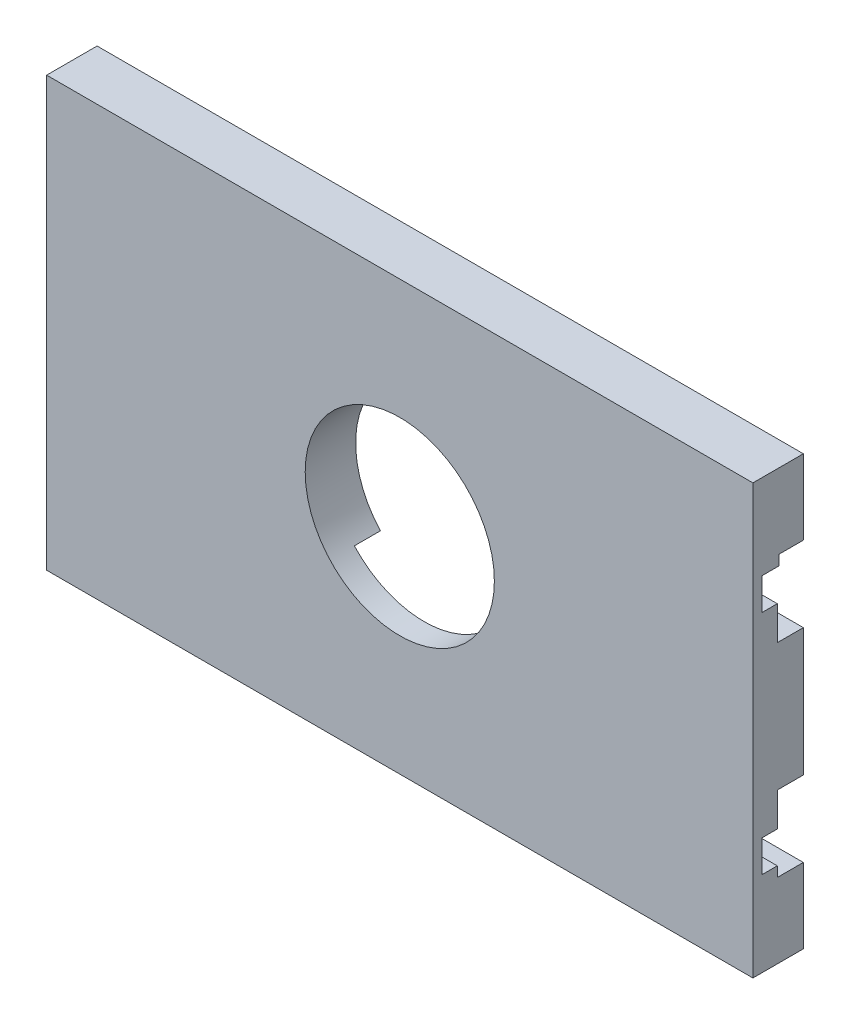
ISO-10303-21;
HEADER;
FILE_DESCRIPTION(('STEP AP214'),'2;1');
FILE_NAME('part.step','',(''),(''),'','','');
FILE_SCHEMA(('AUTOMOTIVE_DESIGN { 1 0 10303 214 1 1 1 1 }'));
ENDSEC;
DATA;
#1=APPLICATION_CONTEXT('core data for automotive mechanical design processes');
#2=APPLICATION_PROTOCOL_DEFINITION('international standard','automotive_design',2000,#1);
#3=PRODUCT_CONTEXT('',#1,'mechanical');
#4=PRODUCT('Part','Part','',(#3));
#5=PRODUCT_RELATED_PRODUCT_CATEGORY('part','',(#4));
#6=PRODUCT_DEFINITION_FORMATION('','',#4);
#7=PRODUCT_DEFINITION_CONTEXT('part definition',#1,'design');
#8=PRODUCT_DEFINITION('design','',#6,#7);
#9=PRODUCT_DEFINITION_SHAPE('','',#8);
#10=(LENGTH_UNIT() NAMED_UNIT(*) SI_UNIT(.MILLI.,.METRE.));
#11=(NAMED_UNIT(*) PLANE_ANGLE_UNIT() SI_UNIT($,.RADIAN.));
#12=(NAMED_UNIT(*) SI_UNIT($,.STERADIAN.) SOLID_ANGLE_UNIT());
#13=UNCERTAINTY_MEASURE_WITH_UNIT(LENGTH_MEASURE(1.E-05),#10,'distance_accuracy_value','');
#14=(GEOMETRIC_REPRESENTATION_CONTEXT(3) GLOBAL_UNCERTAINTY_ASSIGNED_CONTEXT((#13)) GLOBAL_UNIT_ASSIGNED_CONTEXT((#10,
#11,#12)) REPRESENTATION_CONTEXT('',''));
#15=CARTESIAN_POINT('',(0.,0.,0.));
#16=DIRECTION('',(0.,0.,1.));
#17=DIRECTION('',(1.,0.,0.));
#18=AXIS2_PLACEMENT_3D('',#15,#16,#17);
#19=CARTESIAN_POINT('',(140.,-12.650615568503,0.));
#20=DIRECTION('',(0.,1.,0.));
#21=DIRECTION('',(0.,0.,1.));
#22=AXIS2_PLACEMENT_3D('',#19,#20,#21);
#23=PLANE('',#22);
#24=DIRECTION('',(-1.,0.,0.));
#25=VECTOR('',#24,1.);
#26=CARTESIAN_POINT('',(140.,-12.650615568503,-5.));
#27=LINE('',#26,#25);
#28=CARTESIAN_POINT('',(56.1607649872564,-12.650615568503,-5.));
#29=VERTEX_POINT('',#28);
#30=CARTESIAN_POINT('',(0.,-12.650615568503,-5.));
#31=VERTEX_POINT('',#30);
#32=EDGE_CURVE('E308',#29,#31,#27,.T.);
#33=ORIENTED_EDGE('',*,*,#32,.F.);
#34=DIRECTION('',(0.,0.,1.));
#35=VECTOR('',#34,1.);
#36=CARTESIAN_POINT('',(56.1607649872564,-12.650615568503,-5.));
#37=LINE('',#36,#35);
#38=CARTESIAN_POINT('',(56.1607649872564,-12.650615568503,0.1600000000163));
#39=VERTEX_POINT('',#38);
#40=EDGE_CURVE('E224',#29,#39,#37,.T.);
#41=ORIENTED_EDGE('',*,*,#40,.T.);
#42=DIRECTION('',(-1.,0.,0.));
#43=VECTOR('',#42,1.);
#44=CARTESIAN_POINT('',(140.,-12.650615568503,0.1600000000163));
#45=LINE('',#44,#43);
#46=CARTESIAN_POINT('',(0.,-12.650615568503,0.1600000000163));
#47=VERTEX_POINT('',#46);
#48=EDGE_CURVE('E50',#39,#47,#45,.T.);
#49=ORIENTED_EDGE('',*,*,#48,.T.);
#50=DIRECTION('',(0.,0.,-1.));
#51=VECTOR('',#50,1.);
#52=CARTESIAN_POINT('',(0.,-12.650615568503,0.));
#53=LINE('',#52,#51);
#54=EDGE_CURVE('E225',#47,#31,#53,.T.);
#55=ORIENTED_EDGE('',*,*,#54,.T.);
#56=EDGE_LOOP('',(#33,#41,#49,#55));
#57=FACE_BOUND('',#56,.T.);
#58=ADVANCED_FACE('F39',(#57),#23,.F.);
#59=CARTESIAN_POINT('',(140.,0.,-5.));
#60=DIRECTION('',(0.,0.,1.));
#61=DIRECTION('',(1.,0.,0.));
#62=AXIS2_PLACEMENT_3D('',#59,#60,#61);
#63=PLANE('',#62);
#64=DIRECTION('',(-1.,0.,0.));
#65=VECTOR('',#64,1.);
#66=CARTESIAN_POINT('',(140.,12.6506155685612,-5.));
#67=LINE('',#66,#65);
#68=CARTESIAN_POINT('',(56.1607649873096,12.6506155685612,-5.));
#69=VERTEX_POINT('',#68);
#70=CARTESIAN_POINT('',(0.,12.6506155685612,-5.));
#71=VERTEX_POINT('',#70);
#72=EDGE_CURVE('E301',#69,#71,#67,.T.);
#73=ORIENTED_EDGE('',*,*,#72,.F.);
#74=CARTESIAN_POINT('',(70.,0.,-5.));
#75=DIRECTION('',(0.,0.,1.));
#76=DIRECTION('',(1.,0.,0.));
#77=AXIS2_PLACEMENT_3D('',#74,#75,#76);
#78=CIRCLE('',#77,18.75);
#79=EDGE_CURVE('E319',#69,#29,#78,.T.);
#80=ORIENTED_EDGE('',*,*,#79,.T.);
#81=ORIENTED_EDGE('',*,*,#32,.T.);
#82=DIRECTION('',(0.,1.,0.));
#83=VECTOR('',#82,1.);
#84=CARTESIAN_POINT('',(0.,0.,-5.));
#85=LINE('',#84,#83);
#86=EDGE_CURVE('E226',#31,#71,#85,.T.);
#87=ORIENTED_EDGE('',*,*,#86,.T.);
#88=EDGE_LOOP('',(#73,#80,#81,#87));
#89=FACE_BOUND('',#88,.T.);
#90=ADVANCED_FACE('F320',(#89),#63,.F.);
#91=CARTESIAN_POINT('',(140.,12.6506155685612,0.));
#92=DIRECTION('',(0.,1.,0.));
#93=DIRECTION('',(0.,0.,1.));
#94=AXIS2_PLACEMENT_3D('',#91,#92,#93);
#95=PLANE('',#94);
#96=DIRECTION('',(0.,0.,1.));
#97=VECTOR('',#96,1.);
#98=CARTESIAN_POINT('',(56.1607649873096,12.6506155685612,-5.));
#99=LINE('',#98,#97);
#100=CARTESIAN_POINT('',(56.1607649873096,12.6506155685612,0.160000000016301));
#101=VERTEX_POINT('',#100);
#102=EDGE_CURVE('E53',#69,#101,#99,.T.);
#103=ORIENTED_EDGE('',*,*,#102,.F.);
#104=ORIENTED_EDGE('',*,*,#72,.T.);
#105=DIRECTION('',(0.,0.,-1.));
#106=VECTOR('',#105,1.);
#107=CARTESIAN_POINT('',(0.,12.6506155685612,0.));
#108=LINE('',#107,#106);
#109=CARTESIAN_POINT('',(0.,12.6506155685612,0.160000000016302));
#110=VERTEX_POINT('',#109);
#111=EDGE_CURVE('E228',#110,#71,#108,.T.);
#112=ORIENTED_EDGE('',*,*,#111,.F.);
#113=DIRECTION('',(-1.,0.,0.));
#114=VECTOR('',#113,1.);
#115=CARTESIAN_POINT('',(140.,12.6506155685612,0.160000000016302));
#116=LINE('',#115,#114);
#117=EDGE_CURVE('E298',#101,#110,#116,.T.);
#118=ORIENTED_EDGE('',*,*,#117,.F.);
#119=EDGE_LOOP('',(#103,#104,#112,#118));
#120=FACE_BOUND('',#119,.T.);
#121=ADVANCED_FACE('F335',(#120),#95,.T.);
#122=CARTESIAN_POINT('',(140.,0.,0.1600000000163));
#123=DIRECTION('',(0.,0.,1.));
#124=DIRECTION('',(1.,0.,0.));
#125=AXIS2_PLACEMENT_3D('',#122,#123,#124);
#126=PLANE('',#125);
#127=ORIENTED_EDGE('',*,*,#48,.F.);
#128=CARTESIAN_POINT('',(70.,0.,0.1600000000163));
#129=DIRECTION('',(0.,0.,1.));
#130=DIRECTION('',(1.,0.,0.));
#131=AXIS2_PLACEMENT_3D('',#128,#129,#130);
#132=CIRCLE('',#131,18.75);
#133=CARTESIAN_POINT('',(83.8392350127437,-12.650615568503,0.1600000000163));
#134=VERTEX_POINT('',#133);
#135=EDGE_CURVE('E348',#39,#134,#132,.T.);
#136=ORIENTED_EDGE('',*,*,#135,.T.);
#137=CARTESIAN_POINT('',(140.,-12.650615568503,0.1600000000163));
#138=VERTEX_POINT('',#137);
#139=EDGE_CURVE('E11',#138,#134,#45,.T.);
#140=ORIENTED_EDGE('',*,*,#139,.F.);
#141=DIRECTION('',(0.,1.,0.));
#142=VECTOR('',#141,1.);
#143=CARTESIAN_POINT('',(140.,0.,0.1600000000163));
#144=LINE('',#143,#142);
#145=CARTESIAN_POINT('',(140.,-19.3400000000419,0.1600000000163));
#146=VERTEX_POINT('',#145);
#147=EDGE_CURVE('E268',#146,#138,#144,.T.);
#148=ORIENTED_EDGE('',*,*,#147,.F.);
#149=DIRECTION('',(-1.,0.,0.));
#150=VECTOR('',#149,1.);
#151=CARTESIAN_POINT('',(140.,-19.3400000000419,0.1600000000163));
#152=LINE('',#151,#150);
#153=CARTESIAN_POINT('',(0.,-19.3400000000419,0.1600000000163));
#154=VERTEX_POINT('',#153);
#155=EDGE_CURVE('E214',#146,#154,#152,.T.);
#156=ORIENTED_EDGE('',*,*,#155,.T.);
#157=DIRECTION('',(0.,1.,0.));
#158=VECTOR('',#157,1.);
#159=CARTESIAN_POINT('',(0.,0.,0.1600000000163));
#160=LINE('',#159,#158);
#161=EDGE_CURVE('E218',#154,#47,#160,.T.);
#162=ORIENTED_EDGE('',*,*,#161,.T.);
#163=EDGE_LOOP('',(#127,#136,#140,#148,#156,#162));
#164=FACE_BOUND('',#163,.T.);
#165=ADVANCED_FACE('F41',(#164),#126,.F.);
#166=ORIENTED_EDGE('',*,*,#139,.T.);
#167=DIRECTION('',(0.,0.,1.));
#168=VECTOR('',#167,1.);
#169=CARTESIAN_POINT('',(83.8392350127437,-12.650615568503,-5.));
#170=LINE('',#169,#168);
#171=CARTESIAN_POINT('',(83.8392350127437,-12.650615568503,-5.));
#172=VERTEX_POINT('',#171);
#173=EDGE_CURVE('E346',#134,#172,#170,.F.);
#174=ORIENTED_EDGE('',*,*,#173,.T.);
#175=CARTESIAN_POINT('',(140.,-12.650615568503,-5.));
#176=VERTEX_POINT('',#175);
#177=EDGE_CURVE('E307',#176,#172,#27,.T.);
#178=ORIENTED_EDGE('',*,*,#177,.F.);
#179=DIRECTION('',(0.,0.,-1.));
#180=VECTOR('',#179,1.);
#181=CARTESIAN_POINT('',(140.,-12.650615568503,0.));
#182=LINE('',#181,#180);
#183=EDGE_CURVE('E137',#138,#176,#182,.T.);
#184=ORIENTED_EDGE('',*,*,#183,.F.);
#185=EDGE_LOOP('',(#166,#174,#178,#184));
#186=FACE_BOUND('',#185,.T.);
#187=ADVANCED_FACE('F467',(#186),#23,.F.);
#188=ORIENTED_EDGE('',*,*,#177,.T.);
#189=CARTESIAN_POINT('',(83.8392350126905,12.6506155685612,-5.));
#190=VERTEX_POINT('',#189);
#191=EDGE_CURVE('E419',#172,#190,#78,.T.);
#192=ORIENTED_EDGE('',*,*,#191,.T.);
#193=CARTESIAN_POINT('',(140.,12.6506155685612,-5.));
#194=VERTEX_POINT('',#193);
#195=EDGE_CURVE('E304',#194,#190,#67,.T.);
#196=ORIENTED_EDGE('',*,*,#195,.F.);
#197=DIRECTION('',(0.,1.,0.));
#198=VECTOR('',#197,1.);
#199=CARTESIAN_POINT('',(140.,0.,-5.));
#200=LINE('',#199,#198);
#201=EDGE_CURVE('E400',#176,#194,#200,.T.);
#202=ORIENTED_EDGE('',*,*,#201,.F.);
#203=EDGE_LOOP('',(#188,#192,#196,#202));
#204=FACE_BOUND('',#203,.T.);
#205=ADVANCED_FACE('F423',(#204),#63,.F.);
#206=DIRECTION('',(0.,0.,1.));
#207=VECTOR('',#206,1.);
#208=CARTESIAN_POINT('',(83.8392350126905,12.6506155685612,-5.));
#209=LINE('',#208,#207);
#210=CARTESIAN_POINT('',(83.8392350126905,12.6506155685612,0.160000000016301));
#211=VERTEX_POINT('',#210);
#212=EDGE_CURVE('E411',#211,#190,#209,.F.);
#213=ORIENTED_EDGE('',*,*,#212,.F.);
#214=CARTESIAN_POINT('',(140.,12.6506155685612,0.160000000016302));
#215=VERTEX_POINT('',#214);
#216=EDGE_CURVE('E299',#215,#211,#116,.T.);
#217=ORIENTED_EDGE('',*,*,#216,.F.);
#218=DIRECTION('',(0.,0.,-1.));
#219=VECTOR('',#218,1.);
#220=CARTESIAN_POINT('',(140.,12.6506155685612,0.));
#221=LINE('',#220,#219);
#222=EDGE_CURVE('E404',#215,#194,#221,.T.);
#223=ORIENTED_EDGE('',*,*,#222,.T.);
#224=ORIENTED_EDGE('',*,*,#195,.T.);
#225=EDGE_LOOP('',(#213,#217,#223,#224));
#226=FACE_BOUND('',#225,.T.);
#227=ADVANCED_FACE('F424',(#226),#95,.T.);
#228=CARTESIAN_POINT('',(140.,0.,0.1600000000163));
#229=DIRECTION('',(0.,0.,-1.));
#230=DIRECTION('',(0.,1.,0.));
#231=AXIS2_PLACEMENT_3D('',#228,#229,#230);
#232=PLANE('',#231);
#233=CARTESIAN_POINT('',(70.,0.,0.1600000000163));
#234=DIRECTION('',(0.,0.,-1.));
#235=DIRECTION('',(0.,1.,0.));
#236=AXIS2_PLACEMENT_3D('',#233,#234,#235);
#237=CIRCLE('',#236,18.75);
#238=EDGE_CURVE('E412',#101,#211,#237,.T.);
#239=ORIENTED_EDGE('',*,*,#238,.F.);
#240=ORIENTED_EDGE('',*,*,#117,.T.);
#241=DIRECTION('',(0.,-1.,0.));
#242=VECTOR('',#241,1.);
#243=CARTESIAN_POINT('',(0.,0.,0.1600000000163));
#244=LINE('',#243,#242);
#245=CARTESIAN_POINT('',(0.,19.3400000001001,0.160000000016303));
#246=VERTEX_POINT('',#245);
#247=EDGE_CURVE('E234',#246,#110,#244,.T.);
#248=ORIENTED_EDGE('',*,*,#247,.F.);
#249=DIRECTION('',(-1.,0.,0.));
#250=VECTOR('',#249,1.);
#251=CARTESIAN_POINT('',(140.,19.3400000001001,0.160000000016303));
#252=LINE('',#251,#250);
#253=CARTESIAN_POINT('',(140.,19.3400000001001,0.160000000016303));
#254=VERTEX_POINT('',#253);
#255=EDGE_CURVE('E300',#254,#246,#252,.T.);
#256=ORIENTED_EDGE('',*,*,#255,.F.);
#257=DIRECTION('',(0.,-1.,0.));
#258=VECTOR('',#257,1.);
#259=CARTESIAN_POINT('',(140.,0.,0.1600000000163));
#260=LINE('',#259,#258);
#261=EDGE_CURVE('E407',#254,#215,#260,.T.);
#262=ORIENTED_EDGE('',*,*,#261,.T.);
#263=ORIENTED_EDGE('',*,*,#216,.T.);
#264=EDGE_LOOP('',(#239,#240,#248,#256,#262,#263));
#265=FACE_BOUND('',#264,.T.);
#266=ADVANCED_FACE('F429',(#265),#232,.T.);
#267=CARTESIAN_POINT('',(140.,19.3400000001001,0.));
#268=DIRECTION('',(0.,1.,0.));
#269=DIRECTION('',(0.,0.,1.));
#270=AXIS2_PLACEMENT_3D('',#267,#268,#269);
#271=PLANE('',#270);
#272=DIRECTION('',(0.,0.,-1.));
#273=VECTOR('',#272,1.);
#274=CARTESIAN_POINT('',(0.,19.3400000001001,0.));
#275=LINE('',#274,#273);
#276=CARTESIAN_POINT('',(0.,19.3400000001001,3.1600000000308));
#277=VERTEX_POINT('',#276);
#278=EDGE_CURVE('E240',#277,#246,#275,.T.);
#279=ORIENTED_EDGE('',*,*,#278,.F.);
#280=DIRECTION('',(-1.,0.,0.));
#281=VECTOR('',#280,1.);
#282=CARTESIAN_POINT('',(140.,19.3400000001001,3.1600000000308));
#283=LINE('',#282,#281);
#284=CARTESIAN_POINT('',(140.,19.3400000001001,3.1600000000308));
#285=VERTEX_POINT('',#284);
#286=EDGE_CURVE('E293',#285,#277,#283,.T.);
#287=ORIENTED_EDGE('',*,*,#286,.F.);
#288=DIRECTION('',(0.,0.,-1.));
#289=VECTOR('',#288,1.);
#290=CARTESIAN_POINT('',(140.,19.3400000001001,0.));
#291=LINE('',#290,#289);
#292=EDGE_CURVE('E431',#285,#254,#291,.T.);
#293=ORIENTED_EDGE('',*,*,#292,.T.);
#294=ORIENTED_EDGE('',*,*,#255,.T.);
#295=EDGE_LOOP('',(#279,#287,#293,#294));
#296=FACE_BOUND('',#295,.T.);
#297=ADVANCED_FACE('F458',(#296),#271,.T.);
#298=CARTESIAN_POINT('',(140.,0.,3.1600000000308));
#299=DIRECTION('',(0.,0.,-1.));
#300=DIRECTION('',(0.,1.,0.));
#301=AXIS2_PLACEMENT_3D('',#298,#299,#300);
#302=PLANE('',#301);
#303=DIRECTION('',(0.,-1.,0.));
#304=VECTOR('',#303,1.);
#305=CARTESIAN_POINT('',(0.,0.,3.1600000000308));
#306=LINE('',#305,#304);
#307=CARTESIAN_POINT('',(0.,25.6600000000163,3.1600000000308));
#308=VERTEX_POINT('',#307);
#309=EDGE_CURVE('E238',#308,#277,#306,.T.);
#310=ORIENTED_EDGE('',*,*,#309,.F.);
#311=DIRECTION('',(-1.,0.,0.));
#312=VECTOR('',#311,1.);
#313=CARTESIAN_POINT('',(140.,25.6600000000163,3.1600000000308));
#314=LINE('',#313,#312);
#315=CARTESIAN_POINT('',(140.,25.6600000000163,3.1600000000308));
#316=VERTEX_POINT('',#315);
#317=EDGE_CURVE('E291',#316,#308,#314,.T.);
#318=ORIENTED_EDGE('',*,*,#317,.F.);
#319=DIRECTION('',(0.,-1.,0.));
#320=VECTOR('',#319,1.);
#321=CARTESIAN_POINT('',(140.,0.,3.1600000000308));
#322=LINE('',#321,#320);
#323=EDGE_CURVE('E433',#316,#285,#322,.T.);
#324=ORIENTED_EDGE('',*,*,#323,.T.);
#325=ORIENTED_EDGE('',*,*,#286,.T.);
#326=EDGE_LOOP('',(#310,#318,#324,#325));
#327=FACE_BOUND('',#326,.T.);
#328=ADVANCED_FACE('F456',(#327),#302,.T.);
#329=CARTESIAN_POINT('',(140.,25.6600000000163,0.));
#330=DIRECTION('',(0.,-1.,0.));
#331=DIRECTION('',(0.,0.,-1.));
#332=AXIS2_PLACEMENT_3D('',#329,#330,#331);
#333=PLANE('',#332);
#334=DIRECTION('',(0.,0.,1.));
#335=VECTOR('',#334,1.);
#336=CARTESIAN_POINT('',(0.,25.6600000000163,0.));
#337=LINE('',#336,#335);
#338=CARTESIAN_POINT('',(0.,25.6600000000163,-0.159999999976875));
#339=VERTEX_POINT('',#338);
#340=EDGE_CURVE('E242',#339,#308,#337,.T.);
#341=ORIENTED_EDGE('',*,*,#340,.F.);
#342=DIRECTION('',(-1.,0.,0.));
#343=VECTOR('',#342,1.);
#344=CARTESIAN_POINT('',(140.,25.6600000000163,-0.159999999976875));
#345=LINE('',#344,#343);
#346=CARTESIAN_POINT('',(140.,25.6600000000163,-0.159999999976875));
#347=VERTEX_POINT('',#346);
#348=EDGE_CURVE('E292',#347,#339,#345,.T.);
#349=ORIENTED_EDGE('',*,*,#348,.F.);
#350=DIRECTION('',(0.,0.,1.));
#351=VECTOR('',#350,1.);
#352=CARTESIAN_POINT('',(140.,25.6600000000163,0.));
#353=LINE('',#352,#351);
#354=EDGE_CURVE('E437',#347,#316,#353,.T.);
#355=ORIENTED_EDGE('',*,*,#354,.T.);
#356=ORIENTED_EDGE('',*,*,#317,.T.);
#357=EDGE_LOOP('',(#341,#349,#355,#356));
#358=FACE_BOUND('',#357,.T.);
#359=ADVANCED_FACE('F451',(#358),#333,.T.);
#360=CARTESIAN_POINT('',(140.,0.,-0.159999999976875));
#361=DIRECTION('',(0.,0.,-1.));
#362=DIRECTION('',(-1.,0.,0.));
#363=AXIS2_PLACEMENT_3D('',#360,#361,#362);
#364=PLANE('',#363);
#365=DIRECTION('',(0.,-1.,0.));
#366=VECTOR('',#365,1.);
#367=CARTESIAN_POINT('',(0.,0.,-0.159999999976875));
#368=LINE('',#367,#366);
#369=CARTESIAN_POINT('',(0.,27.6600000000163,-0.159999999976875));
#370=VERTEX_POINT('',#369);
#371=EDGE_CURVE('E248',#370,#339,#368,.T.);
#372=ORIENTED_EDGE('',*,*,#371,.F.);
#373=DIRECTION('',(-1.,0.,0.));
#374=VECTOR('',#373,1.);
#375=CARTESIAN_POINT('',(140.,27.6600000000163,-0.159999999976875));
#376=LINE('',#375,#374);
#377=CARTESIAN_POINT('',(140.,27.6600000000163,-0.159999999976875));
#378=VERTEX_POINT('',#377);
#379=EDGE_CURVE('E289',#378,#370,#376,.T.);
#380=ORIENTED_EDGE('',*,*,#379,.F.);
#381=DIRECTION('',(0.,-1.,0.));
#382=VECTOR('',#381,1.);
#383=CARTESIAN_POINT('',(140.,0.,-0.159999999976875));
#384=LINE('',#383,#382);
#385=EDGE_CURVE('E439',#378,#347,#384,.T.);
#386=ORIENTED_EDGE('',*,*,#385,.T.);
#387=ORIENTED_EDGE('',*,*,#348,.T.);
#388=EDGE_LOOP('',(#372,#380,#386,#387));
#389=FACE_BOUND('',#388,.T.);
#390=ADVANCED_FACE('F452',(#389),#364,.T.);
#391=CARTESIAN_POINT('',(140.,27.6600000000163,0.));
#392=DIRECTION('',(0.,-1.,0.));
#393=DIRECTION('',(0.,0.,-1.));
#394=AXIS2_PLACEMENT_3D('',#391,#392,#393);
#395=PLANE('',#394);
#396=DIRECTION('',(0.,0.,1.));
#397=VECTOR('',#396,1.);
#398=CARTESIAN_POINT('',(0.,27.6600000000163,0.));
#399=LINE('',#398,#397);
#400=CARTESIAN_POINT('',(0.,27.6600000000163,-5.));
#401=VERTEX_POINT('',#400);
#402=EDGE_CURVE('E249',#401,#370,#399,.T.);
#403=ORIENTED_EDGE('',*,*,#402,.F.);
#404=DIRECTION('',(-1.,0.,0.));
#405=VECTOR('',#404,1.);
#406=CARTESIAN_POINT('',(140.,27.6600000000163,-5.));
#407=LINE('',#406,#405);
#408=CARTESIAN_POINT('',(140.,27.6600000000163,-5.));
#409=VERTEX_POINT('',#408);
#410=EDGE_CURVE('E290',#409,#401,#407,.T.);
#411=ORIENTED_EDGE('',*,*,#410,.F.);
#412=DIRECTION('',(0.,0.,1.));
#413=VECTOR('',#412,1.);
#414=CARTESIAN_POINT('',(140.,27.6600000000163,0.));
#415=LINE('',#414,#413);
#416=EDGE_CURVE('E394',#409,#378,#415,.T.);
#417=ORIENTED_EDGE('',*,*,#416,.T.);
#418=ORIENTED_EDGE('',*,*,#379,.T.);
#419=EDGE_LOOP('',(#403,#411,#417,#418));
#420=FACE_BOUND('',#419,.T.);
#421=ADVANCED_FACE('F450',(#420),#395,.T.);
#422=CARTESIAN_POINT('',(0.,42.5,-5.));
#423=VERTEX_POINT('',#422);
#424=EDGE_CURVE('E233',#401,#423,#85,.T.);
#425=ORIENTED_EDGE('',*,*,#424,.T.);
#426=DIRECTION('',(-1.,0.,0.));
#427=VECTOR('',#426,1.);
#428=CARTESIAN_POINT('',(140.,42.5,-5.));
#429=LINE('',#428,#427);
#430=CARTESIAN_POINT('',(140.,42.5,-5.));
#431=VERTEX_POINT('',#430);
#432=EDGE_CURVE('E284',#431,#423,#429,.T.);
#433=ORIENTED_EDGE('',*,*,#432,.F.);
#434=EDGE_CURVE('E391',#409,#431,#200,.T.);
#435=ORIENTED_EDGE('',*,*,#434,.F.);
#436=ORIENTED_EDGE('',*,*,#410,.T.);
#437=EDGE_LOOP('',(#425,#433,#435,#436));
#438=FACE_BOUND('',#437,.T.);
#439=ADVANCED_FACE('F378',(#438),#63,.F.);
#440=CARTESIAN_POINT('',(140.,42.5,0.));
#441=DIRECTION('',(0.,1.,0.));
#442=DIRECTION('',(0.,0.,1.));
#443=AXIS2_PLACEMENT_3D('',#440,#441,#442);
#444=PLANE('',#443);
#445=DIRECTION('',(0.,0.,-1.));
#446=VECTOR('',#445,1.);
#447=CARTESIAN_POINT('',(0.,42.5,0.));
#448=LINE('',#447,#446);
#449=CARTESIAN_POINT('',(0.,42.5,5.));
#450=VERTEX_POINT('',#449);
#451=EDGE_CURVE('E252',#450,#423,#448,.T.);
#452=ORIENTED_EDGE('',*,*,#451,.F.);
#453=DIRECTION('',(-1.,0.,0.));
#454=VECTOR('',#453,1.);
#455=CARTESIAN_POINT('',(140.,42.5,5.));
#456=LINE('',#455,#454);
#457=CARTESIAN_POINT('',(140.,42.5,5.));
#458=VERTEX_POINT('',#457);
#459=EDGE_CURVE('E282',#458,#450,#456,.T.);
#460=ORIENTED_EDGE('',*,*,#459,.F.);
#461=DIRECTION('',(0.,0.,-1.));
#462=VECTOR('',#461,1.);
#463=CARTESIAN_POINT('',(140.,42.5,0.));
#464=LINE('',#463,#462);
#465=EDGE_CURVE('E390',#458,#431,#464,.T.);
#466=ORIENTED_EDGE('',*,*,#465,.T.);
#467=ORIENTED_EDGE('',*,*,#432,.T.);
#468=EDGE_LOOP('',(#452,#460,#466,#467));
#469=FACE_BOUND('',#468,.T.);
#470=ADVANCED_FACE('F384',(#469),#444,.T.);
#471=CARTESIAN_POINT('',(140.,0.,5.));
#472=DIRECTION('',(0.,0.,1.));
#473=DIRECTION('',(1.,0.,0.));
#474=AXIS2_PLACEMENT_3D('',#471,#472,#473);
#475=PLANE('',#474);
#476=CARTESIAN_POINT('',(70.,0.,5.));
#477=DIRECTION('',(0.,0.,1.));
#478=DIRECTION('',(1.,0.,0.));
#479=AXIS2_PLACEMENT_3D('',#476,#477,#478);
#480=CIRCLE('',#479,18.75);
#481=CARTESIAN_POINT('',(88.75,0.,5.));
#482=VERTEX_POINT('',#481);
#483=EDGE_CURVE('E417',#482,#482,#480,.T.);
#484=ORIENTED_EDGE('',*,*,#483,.F.);
#485=EDGE_LOOP('',(#484));
#486=FACE_BOUND('',#485,.T.);
#487=DIRECTION('',(0.,1.,0.));
#488=VECTOR('',#487,1.);
#489=CARTESIAN_POINT('',(0.,0.,5.));
#490=LINE('',#489,#488);
#491=CARTESIAN_POINT('',(0.,-42.5,5.));
#492=VERTEX_POINT('',#491);
#493=EDGE_CURVE('E254',#492,#450,#490,.T.);
#494=ORIENTED_EDGE('',*,*,#493,.F.);
#495=DIRECTION('',(-1.,0.,0.));
#496=VECTOR('',#495,1.);
#497=CARTESIAN_POINT('',(140.,-42.5,5.));
#498=LINE('',#497,#496);
#499=CARTESIAN_POINT('',(140.,-42.5,5.));
#500=VERTEX_POINT('',#499);
#501=EDGE_CURVE('E281',#500,#492,#498,.T.);
#502=ORIENTED_EDGE('',*,*,#501,.F.);
#503=DIRECTION('',(0.,1.,0.));
#504=VECTOR('',#503,1.);
#505=CARTESIAN_POINT('',(140.,0.,5.));
#506=LINE('',#505,#504);
#507=EDGE_CURVE('E388',#500,#458,#506,.T.);
#508=ORIENTED_EDGE('',*,*,#507,.T.);
#509=ORIENTED_EDGE('',*,*,#459,.T.);
#510=EDGE_LOOP('',(#494,#502,#508,#509));
#511=FACE_BOUND('',#510,.T.);
#512=ADVANCED_FACE('F501',(#486,#511),#475,.T.);
#513=CARTESIAN_POINT('',(140.,-42.5,0.));
#514=DIRECTION('',(0.,1.,0.));
#515=DIRECTION('',(0.,0.,1.));
#516=AXIS2_PLACEMENT_3D('',#513,#514,#515);
#517=PLANE('',#516);
#518=DIRECTION('',(0.,0.,-1.));
#519=VECTOR('',#518,1.);
#520=CARTESIAN_POINT('',(0.,-42.5,0.));
#521=LINE('',#520,#519);
#522=CARTESIAN_POINT('',(0.,-42.5,-5.));
#523=VERTEX_POINT('',#522);
#524=EDGE_CURVE('E256',#492,#523,#521,.T.);
#525=ORIENTED_EDGE('',*,*,#524,.T.);
#526=DIRECTION('',(-1.,0.,0.));
#527=VECTOR('',#526,1.);
#528=CARTESIAN_POINT('',(140.,-42.5,-5.));
#529=LINE('',#528,#527);
#530=CARTESIAN_POINT('',(140.,-42.5,-5.));
#531=VERTEX_POINT('',#530);
#532=EDGE_CURVE('E279',#531,#523,#529,.T.);
#533=ORIENTED_EDGE('',*,*,#532,.F.);
#534=DIRECTION('',(0.,0.,-1.));
#535=VECTOR('',#534,1.);
#536=CARTESIAN_POINT('',(140.,-42.5,0.));
#537=LINE('',#536,#535);
#538=EDGE_CURVE('E392',#500,#531,#537,.T.);
#539=ORIENTED_EDGE('',*,*,#538,.F.);
#540=ORIENTED_EDGE('',*,*,#501,.T.);
#541=EDGE_LOOP('',(#525,#533,#539,#540));
#542=FACE_BOUND('',#541,.T.);
#543=ADVANCED_FACE('F504',(#542),#517,.F.);
#544=CARTESIAN_POINT('',(0.,-27.6600000000163,-5.));
#545=VERTEX_POINT('',#544);
#546=EDGE_CURVE('E229',#523,#545,#85,.T.);
#547=ORIENTED_EDGE('',*,*,#546,.T.);
#548=DIRECTION('',(-1.,0.,0.));
#549=VECTOR('',#548,1.);
#550=CARTESIAN_POINT('',(140.,-27.6600000000163,-5.));
#551=LINE('',#550,#549);
#552=CARTESIAN_POINT('',(140.,-27.6600000000163,-5.));
#553=VERTEX_POINT('',#552);
#554=EDGE_CURVE('E274',#553,#545,#551,.T.);
#555=ORIENTED_EDGE('',*,*,#554,.F.);
#556=EDGE_CURVE('E371',#531,#553,#200,.T.);
#557=ORIENTED_EDGE('',*,*,#556,.F.);
#558=ORIENTED_EDGE('',*,*,#532,.T.);
#559=EDGE_LOOP('',(#547,#555,#557,#558));
#560=FACE_BOUND('',#559,.T.);
#561=ADVANCED_FACE('F367',(#560),#63,.F.);
#562=CARTESIAN_POINT('',(140.,-27.6600000000163,0.));
#563=DIRECTION('',(0.,-1.,0.));
#564=DIRECTION('',(0.,0.,-1.));
#565=AXIS2_PLACEMENT_3D('',#562,#563,#564);
#566=PLANE('',#565);
#567=DIRECTION('',(0.,0.,1.));
#568=VECTOR('',#567,1.);
#569=CARTESIAN_POINT('',(0.,-27.6600000000163,0.));
#570=LINE('',#569,#568);
#571=CARTESIAN_POINT('',(0.,-27.6600000000163,0.160000000016303));
#572=VERTEX_POINT('',#571);
#573=EDGE_CURVE('E257',#545,#572,#570,.T.);
#574=ORIENTED_EDGE('',*,*,#573,.T.);
#575=DIRECTION('',(-1.,0.,0.));
#576=VECTOR('',#575,1.);
#577=CARTESIAN_POINT('',(140.,-27.6600000000163,0.160000000016303));
#578=LINE('',#577,#576);
#579=CARTESIAN_POINT('',(140.,-27.6600000000163,0.160000000016303));
#580=VERTEX_POINT('',#579);
#581=EDGE_CURVE('E275',#580,#572,#578,.T.);
#582=ORIENTED_EDGE('',*,*,#581,.F.);
#583=DIRECTION('',(0.,0.,1.));
#584=VECTOR('',#583,1.);
#585=CARTESIAN_POINT('',(140.,-27.6600000000163,0.));
#586=LINE('',#585,#584);
#587=EDGE_CURVE('E368',#553,#580,#586,.T.);
#588=ORIENTED_EDGE('',*,*,#587,.F.);
#589=ORIENTED_EDGE('',*,*,#554,.T.);
#590=EDGE_LOOP('',(#574,#582,#588,#589));
#591=FACE_BOUND('',#590,.T.);
#592=ADVANCED_FACE('F364',(#591),#566,.F.);
#593=CARTESIAN_POINT('',(140.,0.,0.160000000016224));
#594=DIRECTION('',(0.,0.,1.));
#595=DIRECTION('',(0.,-1.,0.));
#596=AXIS2_PLACEMENT_3D('',#593,#594,#595);
#597=PLANE('',#596);
#598=DIRECTION('',(0.,1.,0.));
#599=VECTOR('',#598,1.);
#600=CARTESIAN_POINT('',(0.,0.,0.160000000016224));
#601=LINE('',#600,#599);
#602=CARTESIAN_POINT('',(0.,-25.6599999999581,0.160000000016298));
#603=VERTEX_POINT('',#602);
#604=EDGE_CURVE('E265',#572,#603,#601,.T.);
#605=ORIENTED_EDGE('',*,*,#604,.T.);
#606=DIRECTION('',(-1.,0.,0.));
#607=VECTOR('',#606,1.);
#608=CARTESIAN_POINT('',(140.,-25.6599999999581,0.160000000016298));
#609=LINE('',#608,#607);
#610=CARTESIAN_POINT('',(140.,-25.6599999999581,0.160000000016298));
#611=VERTEX_POINT('',#610);
#612=EDGE_CURVE('E209',#611,#603,#609,.T.);
#613=ORIENTED_EDGE('',*,*,#612,.F.);
#614=DIRECTION('',(0.,1.,0.));
#615=VECTOR('',#614,1.);
#616=CARTESIAN_POINT('',(140.,0.,0.160000000016224));
#617=LINE('',#616,#615);
#618=EDGE_CURVE('E197',#580,#611,#617,.T.);
#619=ORIENTED_EDGE('',*,*,#618,.F.);
#620=ORIENTED_EDGE('',*,*,#581,.T.);
#621=EDGE_LOOP('',(#605,#613,#619,#620));
#622=FACE_BOUND('',#621,.T.);
#623=ADVANCED_FACE('F363',(#622),#597,.F.);
#624=CARTESIAN_POINT('',(140.,-25.6599999999581,0.));
#625=DIRECTION('',(0.,-1.,0.));
#626=DIRECTION('',(0.,0.,-1.));
#627=AXIS2_PLACEMENT_3D('',#624,#625,#626);
#628=PLANE('',#627);
#629=DIRECTION('',(0.,0.,1.));
#630=VECTOR('',#629,1.);
#631=CARTESIAN_POINT('',(0.,-25.6599999999581,0.));
#632=LINE('',#631,#630);
#633=CARTESIAN_POINT('',(0.,-25.6599999999581,3.1600000000308));
#634=VERTEX_POINT('',#633);
#635=EDGE_CURVE('E206',#603,#634,#632,.T.);
#636=ORIENTED_EDGE('',*,*,#635,.T.);
#637=DIRECTION('',(-1.,0.,0.));
#638=VECTOR('',#637,1.);
#639=CARTESIAN_POINT('',(140.,-25.6599999999581,3.1600000000308));
#640=LINE('',#639,#638);
#641=CARTESIAN_POINT('',(140.,-25.6599999999581,3.1600000000308));
#642=VERTEX_POINT('',#641);
#643=EDGE_CURVE('E201',#642,#634,#640,.T.);
#644=ORIENTED_EDGE('',*,*,#643,.F.);
#645=DIRECTION('',(0.,0.,1.));
#646=VECTOR('',#645,1.);
#647=CARTESIAN_POINT('',(140.,-25.6599999999581,0.));
#648=LINE('',#647,#646);
#649=EDGE_CURVE('E193',#611,#642,#648,.T.);
#650=ORIENTED_EDGE('',*,*,#649,.F.);
#651=ORIENTED_EDGE('',*,*,#612,.T.);
#652=EDGE_LOOP('',(#636,#644,#650,#651));
#653=FACE_BOUND('',#652,.T.);
#654=ADVANCED_FACE('F204',(#653),#628,.F.);
#655=CARTESIAN_POINT('',(140.,0.,3.16000000003079));
#656=DIRECTION('',(0.,0.,-1.));
#657=DIRECTION('',(0.,1.,0.));
#658=AXIS2_PLACEMENT_3D('',#655,#656,#657);
#659=PLANE('',#658);
#660=DIRECTION('',(0.,-1.,0.));
#661=VECTOR('',#660,1.);
#662=CARTESIAN_POINT('',(0.,0.,3.16000000003079));
#663=LINE('',#662,#661);
#664=CARTESIAN_POINT('',(0.,-19.3400000000419,3.1600000000308));
#665=VERTEX_POINT('',#664);
#666=EDGE_CURVE('E264',#665,#634,#663,.T.);
#667=ORIENTED_EDGE('',*,*,#666,.F.);
#668=DIRECTION('',(-1.,0.,0.));
#669=VECTOR('',#668,1.);
#670=CARTESIAN_POINT('',(140.,-19.3400000000419,3.1600000000308));
#671=LINE('',#670,#669);
#672=CARTESIAN_POINT('',(140.,-19.3400000000419,3.1600000000308));
#673=VERTEX_POINT('',#672);
#674=EDGE_CURVE('E211',#673,#665,#671,.T.);
#675=ORIENTED_EDGE('',*,*,#674,.F.);
#676=DIRECTION('',(0.,-1.,0.));
#677=VECTOR('',#676,1.);
#678=CARTESIAN_POINT('',(140.,0.,3.16000000003079));
#679=LINE('',#678,#677);
#680=EDGE_CURVE('E192',#673,#642,#679,.T.);
#681=ORIENTED_EDGE('',*,*,#680,.T.);
#682=ORIENTED_EDGE('',*,*,#643,.T.);
#683=EDGE_LOOP('',(#667,#675,#681,#682));
#684=FACE_BOUND('',#683,.T.);
#685=ADVANCED_FACE('F213',(#684),#659,.T.);
#686=CARTESIAN_POINT('',(140.,-19.3400000000419,0.));
#687=DIRECTION('',(0.,1.,0.));
#688=DIRECTION('',(0.,0.,1.));
#689=AXIS2_PLACEMENT_3D('',#686,#687,#688);
#690=PLANE('',#689);
#691=DIRECTION('',(0.,0.,-1.));
#692=VECTOR('',#691,1.);
#693=CARTESIAN_POINT('',(0.,-19.3400000000419,0.));
#694=LINE('',#693,#692);
#695=EDGE_CURVE('E135',#665,#154,#694,.T.);
#696=ORIENTED_EDGE('',*,*,#695,.T.);
#697=ORIENTED_EDGE('',*,*,#155,.F.);
#698=DIRECTION('',(0.,0.,-1.));
#699=VECTOR('',#698,1.);
#700=CARTESIAN_POINT('',(140.,-19.3400000000419,0.));
#701=LINE('',#700,#699);
#702=EDGE_CURVE('E62',#673,#146,#701,.T.);
#703=ORIENTED_EDGE('',*,*,#702,.F.);
#704=ORIENTED_EDGE('',*,*,#674,.T.);
#705=EDGE_LOOP('',(#696,#697,#703,#704));
#706=FACE_BOUND('',#705,.T.);
#707=ADVANCED_FACE('F550',(#706),#690,.F.);
#708=CARTESIAN_POINT('',(140.,0.,0.));
#709=DIRECTION('',(1.,0.,0.));
#710=DIRECTION('',(0.,0.,-1.));
#711=AXIS2_PLACEMENT_3D('',#708,#709,#710);
#712=PLANE('',#711);
#713=ORIENTED_EDGE('',*,*,#147,.T.);
#714=ORIENTED_EDGE('',*,*,#183,.T.);
#715=ORIENTED_EDGE('',*,*,#201,.T.);
#716=ORIENTED_EDGE('',*,*,#222,.F.);
#717=ORIENTED_EDGE('',*,*,#261,.F.);
#718=ORIENTED_EDGE('',*,*,#292,.F.);
#719=ORIENTED_EDGE('',*,*,#323,.F.);
#720=ORIENTED_EDGE('',*,*,#354,.F.);
#721=ORIENTED_EDGE('',*,*,#385,.F.);
#722=ORIENTED_EDGE('',*,*,#416,.F.);
#723=ORIENTED_EDGE('',*,*,#434,.T.);
#724=ORIENTED_EDGE('',*,*,#465,.F.);
#725=ORIENTED_EDGE('',*,*,#507,.F.);
#726=ORIENTED_EDGE('',*,*,#538,.T.);
#727=ORIENTED_EDGE('',*,*,#556,.T.);
#728=ORIENTED_EDGE('',*,*,#587,.T.);
#729=ORIENTED_EDGE('',*,*,#618,.T.);
#730=ORIENTED_EDGE('',*,*,#649,.T.);
#731=ORIENTED_EDGE('',*,*,#680,.F.);
#732=ORIENTED_EDGE('',*,*,#702,.T.);
#733=EDGE_LOOP('',(#713,#714,#715,#716,#717,#718,#719,#720,#721,#722,#723,#724,#725,#726,#727,
#728,#729,#730,#731,#732));
#734=FACE_BOUND('',#733,.T.);
#735=ADVANCED_FACE('F191',(#734),#712,.T.);
#736=CARTESIAN_POINT('',(0.,0.,0.));
#737=DIRECTION('',(1.,0.,0.));
#738=DIRECTION('',(0.,0.,-1.));
#739=AXIS2_PLACEMENT_3D('',#736,#737,#738);
#740=PLANE('',#739);
#741=ORIENTED_EDGE('',*,*,#161,.F.);
#742=ORIENTED_EDGE('',*,*,#695,.F.);
#743=ORIENTED_EDGE('',*,*,#666,.T.);
#744=ORIENTED_EDGE('',*,*,#635,.F.);
#745=ORIENTED_EDGE('',*,*,#604,.F.);
#746=ORIENTED_EDGE('',*,*,#573,.F.);
#747=ORIENTED_EDGE('',*,*,#546,.F.);
#748=ORIENTED_EDGE('',*,*,#524,.F.);
#749=ORIENTED_EDGE('',*,*,#493,.T.);
#750=ORIENTED_EDGE('',*,*,#451,.T.);
#751=ORIENTED_EDGE('',*,*,#424,.F.);
#752=ORIENTED_EDGE('',*,*,#402,.T.);
#753=ORIENTED_EDGE('',*,*,#371,.T.);
#754=ORIENTED_EDGE('',*,*,#340,.T.);
#755=ORIENTED_EDGE('',*,*,#309,.T.);
#756=ORIENTED_EDGE('',*,*,#278,.T.);
#757=ORIENTED_EDGE('',*,*,#247,.T.);
#758=ORIENTED_EDGE('',*,*,#111,.T.);
#759=ORIENTED_EDGE('',*,*,#86,.F.);
#760=ORIENTED_EDGE('',*,*,#54,.F.);
#761=EDGE_LOOP('',(#741,#742,#743,#744,#745,#746,#747,#748,#749,#750,#751,#752,#753,#754,#755,
#756,#757,#758,#759,#760));
#762=FACE_BOUND('',#761,.T.);
#763=ADVANCED_FACE('F330',(#762),#740,.F.);
#764=CARTESIAN_POINT('',(70.,0.,-5.));
#765=DIRECTION('',(0.,0.,1.));
#766=DIRECTION('',(1.,0.,0.));
#767=AXIS2_PLACEMENT_3D('',#764,#765,#766);
#768=CYLINDRICAL_SURFACE('',#767,18.75);
#769=ORIENTED_EDGE('',*,*,#483,.T.);
#770=EDGE_LOOP('',(#769));
#771=FACE_BOUND('',#770,.T.);
#772=ORIENTED_EDGE('',*,*,#79,.F.);
#773=ORIENTED_EDGE('',*,*,#102,.T.);
#774=ORIENTED_EDGE('',*,*,#238,.T.);
#775=ORIENTED_EDGE('',*,*,#212,.T.);
#776=ORIENTED_EDGE('',*,*,#191,.F.);
#777=ORIENTED_EDGE('',*,*,#173,.F.);
#778=ORIENTED_EDGE('',*,*,#135,.F.);
#779=ORIENTED_EDGE('',*,*,#40,.F.);
#780=EDGE_LOOP('',(#772,#773,#774,#775,#776,#777,#778,#779));
#781=FACE_BOUND('',#780,.T.);
#782=ADVANCED_FACE('F351',(#771,#781),#768,.F.);
#783=CLOSED_SHELL('',(#58,#90,#121,#165,#187,#205,#227,#266,#297,#328,#359,#390,#421,#439,#470,
#512,#543,#561,#592,#623,#654,#685,#707,#735,#763,#782));
#784=MANIFOLD_SOLID_BREP('B2',#783);
#785=ADVANCED_BREP_SHAPE_REPRESENTATION('',(#18,#784),#14);
#786=SHAPE_DEFINITION_REPRESENTATION(#9,#785);
ENDSEC;
END-ISO-10303-21;
